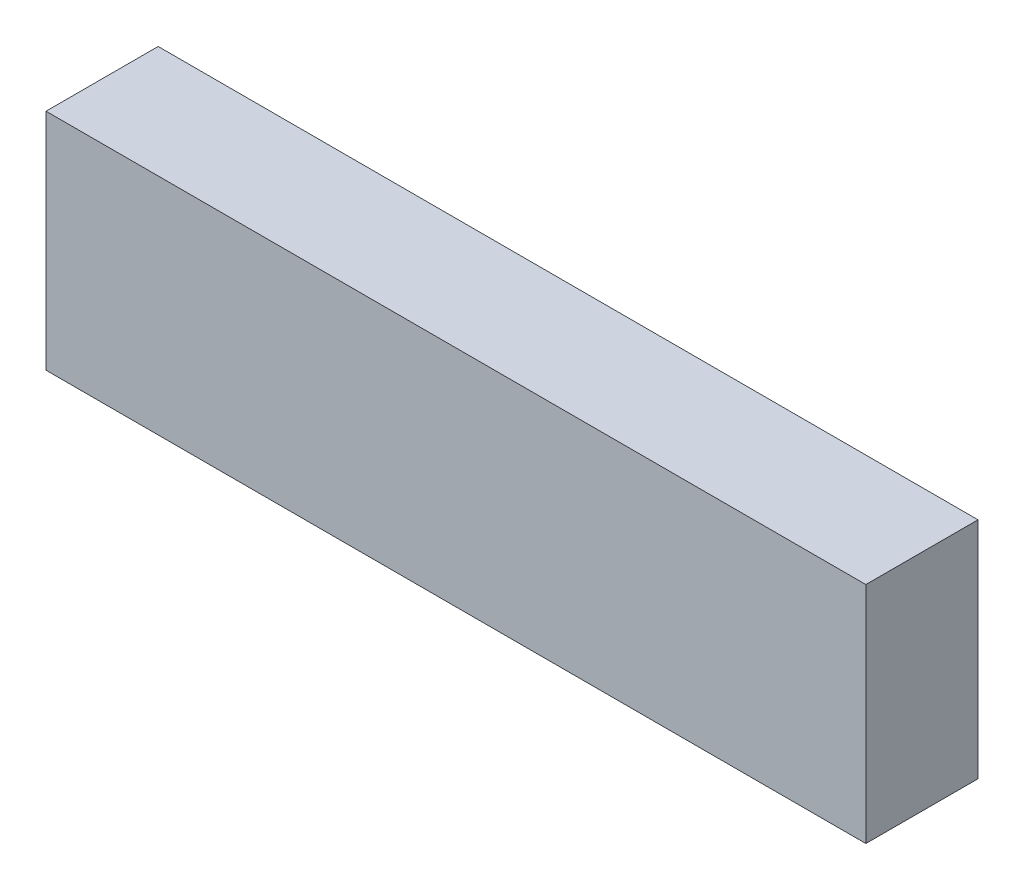
ISO-10303-21;
HEADER;
FILE_DESCRIPTION(('STEP AP214'),'2;1');
FILE_NAME('part.step','',(''),(''),'','','');
FILE_SCHEMA(('AUTOMOTIVE_DESIGN { 1 0 10303 214 1 1 1 1 }'));
ENDSEC;
DATA;
#1=APPLICATION_CONTEXT('core data for automotive mechanical design processes');
#2=APPLICATION_PROTOCOL_DEFINITION('international standard','automotive_design',2000,#1);
#3=PRODUCT_CONTEXT('',#1,'mechanical');
#4=PRODUCT('Part','Part','',(#3));
#5=PRODUCT_RELATED_PRODUCT_CATEGORY('part','',(#4));
#6=PRODUCT_DEFINITION_FORMATION('','',#4);
#7=PRODUCT_DEFINITION_CONTEXT('part definition',#1,'design');
#8=PRODUCT_DEFINITION('design','',#6,#7);
#9=PRODUCT_DEFINITION_SHAPE('','',#8);
#10=(LENGTH_UNIT() NAMED_UNIT(*) SI_UNIT(.MILLI.,.METRE.));
#11=(NAMED_UNIT(*) PLANE_ANGLE_UNIT() SI_UNIT($,.RADIAN.));
#12=(NAMED_UNIT(*) SI_UNIT($,.STERADIAN.) SOLID_ANGLE_UNIT());
#13=UNCERTAINTY_MEASURE_WITH_UNIT(LENGTH_MEASURE(1.E-05),#10,'distance_accuracy_value','');
#14=(GEOMETRIC_REPRESENTATION_CONTEXT(3) GLOBAL_UNCERTAINTY_ASSIGNED_CONTEXT((#13)) GLOBAL_UNIT_ASSIGNED_CONTEXT((#10,
#11,#12)) REPRESENTATION_CONTEXT('',''));
#15=CARTESIAN_POINT('',(0.,0.,0.));
#16=DIRECTION('',(0.,0.,1.));
#17=DIRECTION('',(1.,0.,0.));
#18=AXIS2_PLACEMENT_3D('',#15,#16,#17);
#19=CARTESIAN_POINT('',(0.,0.,10.));
#20=DIRECTION('',(1.,0.,0.));
#21=DIRECTION('',(0.,0.,-1.));
#22=AXIS2_PLACEMENT_3D('',#19,#20,#21);
#23=PLANE('',#22);
#24=DIRECTION('',(0.,-1.,0.));
#25=VECTOR('',#24,1.);
#26=CARTESIAN_POINT('',(0.,0.,0.));
#27=LINE('',#26,#25);
#28=CARTESIAN_POINT('',(0.,20.,0.));
#29=VERTEX_POINT('',#28);
#30=CARTESIAN_POINT('',(0.,0.,0.));
#31=VERTEX_POINT('',#30);
#32=EDGE_CURVE('E106',#29,#31,#27,.T.);
#33=ORIENTED_EDGE('',*,*,#32,.T.);
#34=DIRECTION('',(0.,0.,-1.));
#35=VECTOR('',#34,1.);
#36=CARTESIAN_POINT('',(0.,0.,10.));
#37=LINE('',#36,#35);
#38=CARTESIAN_POINT('',(0.,0.,10.));
#39=VERTEX_POINT('',#38);
#40=EDGE_CURVE('E11',#39,#31,#37,.T.);
#41=ORIENTED_EDGE('',*,*,#40,.F.);
#42=DIRECTION('',(0.,-1.,0.));
#43=VECTOR('',#42,1.);
#44=CARTESIAN_POINT('',(0.,0.,10.));
#45=LINE('',#44,#43);
#46=CARTESIAN_POINT('',(0.,20.,10.));
#47=VERTEX_POINT('',#46);
#48=EDGE_CURVE('E92',#47,#39,#45,.T.);
#49=ORIENTED_EDGE('',*,*,#48,.F.);
#50=DIRECTION('',(0.,0.,-1.));
#51=VECTOR('',#50,1.);
#52=CARTESIAN_POINT('',(0.,20.,10.));
#53=LINE('',#52,#51);
#54=EDGE_CURVE('E105',#47,#29,#53,.T.);
#55=ORIENTED_EDGE('',*,*,#54,.T.);
#56=EDGE_LOOP('',(#33,#41,#49,#55));
#57=FACE_BOUND('',#56,.T.);
#58=ADVANCED_FACE('F43',(#57),#23,.F.);
#59=CARTESIAN_POINT('',(0.,0.,10.));
#60=DIRECTION('',(0.,1.,0.));
#61=DIRECTION('',(0.,0.,1.));
#62=AXIS2_PLACEMENT_3D('',#59,#60,#61);
#63=PLANE('',#62);
#64=DIRECTION('',(1.,0.,0.));
#65=VECTOR('',#64,1.);
#66=CARTESIAN_POINT('',(0.,0.,0.));
#67=LINE('',#66,#65);
#68=CARTESIAN_POINT('',(73.1,0.,0.));
#69=VERTEX_POINT('',#68);
#70=EDGE_CURVE('E97',#31,#69,#67,.T.);
#71=ORIENTED_EDGE('',*,*,#70,.T.);
#72=DIRECTION('',(0.,0.,-1.));
#73=VECTOR('',#72,1.);
#74=CARTESIAN_POINT('',(73.1,0.,10.));
#75=LINE('',#74,#73);
#76=CARTESIAN_POINT('',(73.1,0.,10.));
#77=VERTEX_POINT('',#76);
#78=EDGE_CURVE('E51',#77,#69,#75,.T.);
#79=ORIENTED_EDGE('',*,*,#78,.F.);
#80=DIRECTION('',(1.,0.,0.));
#81=VECTOR('',#80,1.);
#82=CARTESIAN_POINT('',(0.,0.,10.));
#83=LINE('',#82,#81);
#84=EDGE_CURVE('E87',#39,#77,#83,.T.);
#85=ORIENTED_EDGE('',*,*,#84,.F.);
#86=ORIENTED_EDGE('',*,*,#40,.T.);
#87=EDGE_LOOP('',(#71,#79,#85,#86));
#88=FACE_BOUND('',#87,.T.);
#89=ADVANCED_FACE('F100',(#88),#63,.F.);
#90=CARTESIAN_POINT('',(73.1,0.,10.));
#91=DIRECTION('',(-1.,0.,0.));
#92=DIRECTION('',(0.,0.,1.));
#93=AXIS2_PLACEMENT_3D('',#90,#91,#92);
#94=PLANE('',#93);
#95=DIRECTION('',(0.,1.,0.));
#96=VECTOR('',#95,1.);
#97=CARTESIAN_POINT('',(73.1,0.,0.));
#98=LINE('',#97,#96);
#99=CARTESIAN_POINT('',(73.1,20.,0.));
#100=VERTEX_POINT('',#99);
#101=EDGE_CURVE('E78',#69,#100,#98,.T.);
#102=ORIENTED_EDGE('',*,*,#101,.T.);
#103=DIRECTION('',(0.,0.,-1.));
#104=VECTOR('',#103,1.);
#105=CARTESIAN_POINT('',(73.1,20.,10.));
#106=LINE('',#105,#104);
#107=CARTESIAN_POINT('',(73.1,20.,10.));
#108=VERTEX_POINT('',#107);
#109=EDGE_CURVE('E98',#108,#100,#106,.T.);
#110=ORIENTED_EDGE('',*,*,#109,.F.);
#111=DIRECTION('',(0.,1.,0.));
#112=VECTOR('',#111,1.);
#113=CARTESIAN_POINT('',(73.1,0.,10.));
#114=LINE('',#113,#112);
#115=EDGE_CURVE('E95',#77,#108,#114,.T.);
#116=ORIENTED_EDGE('',*,*,#115,.F.);
#117=ORIENTED_EDGE('',*,*,#78,.T.);
#118=EDGE_LOOP('',(#102,#110,#116,#117));
#119=FACE_BOUND('',#118,.T.);
#120=ADVANCED_FACE('F99',(#119),#94,.F.);
#121=CARTESIAN_POINT('',(0.,20.,10.));
#122=DIRECTION('',(0.,-1.,0.));
#123=DIRECTION('',(0.,0.,-1.));
#124=AXIS2_PLACEMENT_3D('',#121,#122,#123);
#125=PLANE('',#124);
#126=DIRECTION('',(-1.,0.,0.));
#127=VECTOR('',#126,1.);
#128=CARTESIAN_POINT('',(0.,20.,0.));
#129=LINE('',#128,#127);
#130=EDGE_CURVE('E85',#100,#29,#129,.T.);
#131=ORIENTED_EDGE('',*,*,#130,.T.);
#132=ORIENTED_EDGE('',*,*,#54,.F.);
#133=DIRECTION('',(-1.,0.,0.));
#134=VECTOR('',#133,1.);
#135=CARTESIAN_POINT('',(0.,20.,10.));
#136=LINE('',#135,#134);
#137=EDGE_CURVE('E56',#108,#47,#136,.T.);
#138=ORIENTED_EDGE('',*,*,#137,.F.);
#139=ORIENTED_EDGE('',*,*,#109,.T.);
#140=EDGE_LOOP('',(#131,#132,#138,#139));
#141=FACE_BOUND('',#140,.T.);
#142=ADVANCED_FACE('F111',(#141),#125,.F.);
#143=CARTESIAN_POINT('',(0.,0.,10.));
#144=DIRECTION('',(0.,0.,-1.));
#145=DIRECTION('',(-1.,0.,0.));
#146=AXIS2_PLACEMENT_3D('',#143,#144,#145);
#147=PLANE('',#146);
#148=ORIENTED_EDGE('',*,*,#48,.T.);
#149=ORIENTED_EDGE('',*,*,#84,.T.);
#150=ORIENTED_EDGE('',*,*,#115,.T.);
#151=ORIENTED_EDGE('',*,*,#137,.T.);
#152=EDGE_LOOP('',(#148,#149,#150,#151));
#153=FACE_BOUND('',#152,.T.);
#154=ADVANCED_FACE('F89',(#153),#147,.F.);
#155=CARTESIAN_POINT('',(0.,0.,0.));
#156=DIRECTION('',(0.,0.,-1.));
#157=DIRECTION('',(-1.,0.,0.));
#158=AXIS2_PLACEMENT_3D('',#155,#156,#157);
#159=PLANE('',#158);
#160=ORIENTED_EDGE('',*,*,#32,.F.);
#161=ORIENTED_EDGE('',*,*,#130,.F.);
#162=ORIENTED_EDGE('',*,*,#101,.F.);
#163=ORIENTED_EDGE('',*,*,#70,.F.);
#164=EDGE_LOOP('',(#160,#161,#162,#163));
#165=FACE_BOUND('',#164,.T.);
#166=ADVANCED_FACE('F116',(#165),#159,.T.);
#167=CLOSED_SHELL('',(#58,#89,#120,#142,#154,#166));
#168=MANIFOLD_SOLID_BREP('B2',#167);
#169=ADVANCED_BREP_SHAPE_REPRESENTATION('',(#18,#168),#14);
#170=SHAPE_DEFINITION_REPRESENTATION(#9,#169);
ENDSEC;
END-ISO-10303-21;
